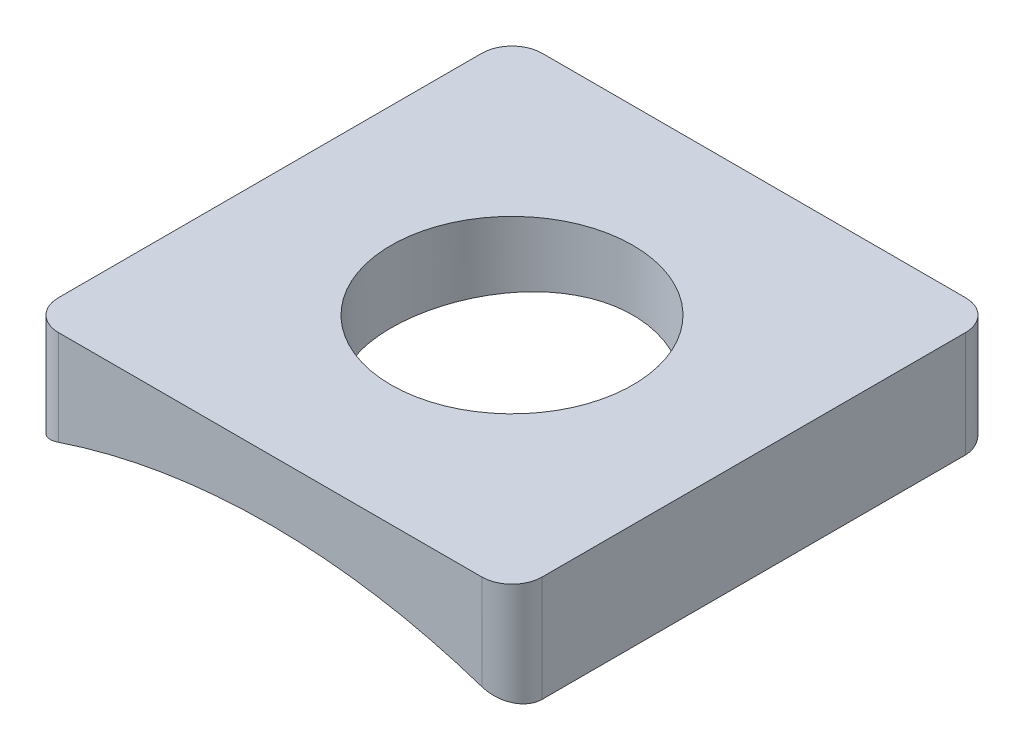
ISO-10303-21;
HEADER;
FILE_DESCRIPTION(('STEP AP214'),'2;1');
FILE_NAME('part.step','',(''),(''),'','','');
FILE_SCHEMA(('AUTOMOTIVE_DESIGN { 1 0 10303 214 1 1 1 1 }'));
ENDSEC;
DATA;
#1=APPLICATION_CONTEXT('core data for automotive mechanical design processes');
#2=APPLICATION_PROTOCOL_DEFINITION('international standard','automotive_design',2000,#1);
#3=PRODUCT_CONTEXT('',#1,'mechanical');
#4=PRODUCT('Part','Part','',(#3));
#5=PRODUCT_RELATED_PRODUCT_CATEGORY('part','',(#4));
#6=PRODUCT_DEFINITION_FORMATION('','',#4);
#7=PRODUCT_DEFINITION_CONTEXT('part definition',#1,'design');
#8=PRODUCT_DEFINITION('design','',#6,#7);
#9=PRODUCT_DEFINITION_SHAPE('','',#8);
#10=(LENGTH_UNIT() NAMED_UNIT(*) SI_UNIT(.MILLI.,.METRE.));
#11=(NAMED_UNIT(*) PLANE_ANGLE_UNIT() SI_UNIT($,.RADIAN.));
#12=(NAMED_UNIT(*) SI_UNIT($,.STERADIAN.) SOLID_ANGLE_UNIT());
#13=UNCERTAINTY_MEASURE_WITH_UNIT(LENGTH_MEASURE(1.E-05),#10,'distance_accuracy_value','');
#14=(GEOMETRIC_REPRESENTATION_CONTEXT(3) GLOBAL_UNCERTAINTY_ASSIGNED_CONTEXT((#13)) GLOBAL_UNIT_ASSIGNED_CONTEXT((#10,
#11,#12)) REPRESENTATION_CONTEXT('',''));
#15=CARTESIAN_POINT('',(0.,0.,0.));
#16=DIRECTION('',(0.,0.,1.));
#17=DIRECTION('',(1.,0.,0.));
#18=AXIS2_PLACEMENT_3D('',#15,#16,#17);
#19=CARTESIAN_POINT('',(0.,-11.1234753829798,8.));
#20=DIRECTION('',(0.,0.,-1.));
#21=DIRECTION('',(-1.,0.,0.));
#22=AXIS2_PLACEMENT_3D('',#19,#20,#21);
#23=CYLINDRICAL_SURFACE('',#22,11.);
#24=CARTESIAN_POINT('',(0.,-0.123475382979799,6.));
#25=CARTESIAN_POINT('',(-0.111357271644374,-0.123477375701219,5.99999568133932));
#26=CARTESIAN_POINT('',(-0.222771449918203,-0.125183855645452,5.99066824251735));
#27=CARTESIAN_POINT('',(-0.44246440684831,-0.13182690795984,5.95362653397508));
#28=CARTESIAN_POINT('',(-0.550740387266075,-0.136766275754395,5.92589635141863));
#29=CARTESIAN_POINT('',(-0.760947572513748,-0.149322150629141,5.85292287032901));
#30=CARTESIAN_POINT('',(-0.862884263930177,-0.156936303660599,5.80769496781024));
#31=CARTESIAN_POINT('',(-1.0577120033845,-0.174008667996809,5.70105266880821));
#32=CARTESIAN_POINT('',(-1.15060386767905,-0.183466712666582,5.6396397348118));
#33=CARTESIAN_POINT('',(-1.32576444051238,-0.203301047981474,5.50163409035729));
#34=CARTESIAN_POINT('',(-1.40791622603346,-0.213685657009012,5.42489415801924));
#35=CARTESIAN_POINT('',(-1.55825357341079,-0.234140430861728,5.25872964591017));
#36=CARTESIAN_POINT('',(-1.62643816794977,-0.244210573867217,5.16930418831085));
#37=CARTESIAN_POINT('',(-1.74738695016477,-0.262976980882142,4.97948727054022));
#38=CARTESIAN_POINT('',(-1.80003313265556,-0.27166251187882,4.87901946476962));
#39=CARTESIAN_POINT('',(-1.88765546949978,-0.286559550210778,4.67048134967603));
#40=CARTESIAN_POINT('',(-1.92263305283275,-0.29277125761236,4.56241165597496));
#41=CARTESIAN_POINT('',(-1.97355197711315,-0.301933847812737,4.3429853506434));
#42=CARTESIAN_POINT('',(-1.98969666425445,-0.304919536756361,4.23167740829037));
#43=CARTESIAN_POINT('',(-2.00312248736688,-0.307397068656701,4.00789559268543));
#44=CARTESIAN_POINT('',(-2.00040521296643,-0.306889206039284,3.89542181848397));
#45=CARTESIAN_POINT('',(-1.97634934427,-0.302468732488003,3.67396808586698));
#46=CARTESIAN_POINT('',(-1.95524117699072,-0.298598254837168,3.56496213210428));
#47=CARTESIAN_POINT('',(-1.89536523340026,-0.287954770240701,3.35206498163283));
#48=CARTESIAN_POINT('',(-1.85659674743188,-0.281181646656621,3.24817399064821));
#49=CARTESIAN_POINT('',(-1.76227297789296,-0.265451567452645,3.04777720922126));
#50=CARTESIAN_POINT('',(-1.7066239037154,-0.256482465836288,2.95131655733387));
#51=CARTESIAN_POINT('',(-1.58018503374043,-0.237379162862632,2.76901526305471));
#52=CARTESIAN_POINT('',(-1.50939379023584,-0.227244850145118,2.68317563735376));
#53=CARTESIAN_POINT('',(-1.35343399418352,-0.206768974894349,2.52322100355563));
#54=CARTESIAN_POINT('',(-1.2680681726569,-0.196426564815125,2.44929831156309));
#55=CARTESIAN_POINT('',(-1.08604454069331,-0.17683787860892,2.31679486651917));
#56=CARTESIAN_POINT('',(-0.989386629498158,-0.167591612264205,2.25821425037873));
#57=CARTESIAN_POINT('',(-0.787327598497297,-0.151220004726391,2.15803261021497));
#58=CARTESIAN_POINT('',(-0.681916780395493,-0.144097057387577,2.11645073130402));
#59=CARTESIAN_POINT('',(-0.465448414462667,-0.132793328270973,2.05163680750629));
#60=CARTESIAN_POINT('',(-0.354391431316065,-0.128612252888843,2.02840293142609));
#61=CARTESIAN_POINT('',(-0.1314386495785,-0.123703449193215,2.00121023808088));
#62=CARTESIAN_POINT('',(-0.0195760121089348,-0.122928489568368,1.99698777654592));
#63=CARTESIAN_POINT('',(0.203257238970967,-0.124789080504808,2.00723179818149));
#64=CARTESIAN_POINT('',(0.314227893453081,-0.127424473892694,2.02169742007174));
#65=CARTESIAN_POINT('',(0.531297097592757,-0.135780296655279,2.06868774956188));
#66=CARTESIAN_POINT('',(0.637425297458317,-0.141478067258185,2.10107986918283));
#67=CARTESIAN_POINT('',(0.84274471375661,-0.155322431757575,2.18286082852194));
#68=CARTESIAN_POINT('',(0.941935480960948,-0.163469184055446,2.2322507676977));
#69=CARTESIAN_POINT('',(1.13169524707493,-0.18142558713139,2.34721463780293));
#70=CARTESIAN_POINT('',(1.22216445208488,-0.191251566833794,2.41295068715592));
#71=CARTESIAN_POINT('',(1.39088213822347,-0.211432502268945,2.5585203766711));
#72=CARTESIAN_POINT('',(1.46912954974332,-0.221787504194749,2.63835524941194));
#73=CARTESIAN_POINT('',(1.6121773788768,-0.242014987403366,2.8110468814485));
#74=CARTESIAN_POINT('',(1.67679836741418,-0.251879861760943,2.90405330652586));
#75=CARTESIAN_POINT('',(1.78949986552013,-0.269860282169599,3.09975618140649));
#76=CARTESIAN_POINT('',(1.83758096630795,-0.277975890744411,3.20245228468438));
#77=CARTESIAN_POINT('',(1.91557945241746,-0.291479936825028,3.41415074969175));
#78=CARTESIAN_POINT('',(1.9455810786184,-0.296881002812321,3.52312123073806));
#79=CARTESIAN_POINT('',(1.98683040178554,-0.304374117525901,3.74466298863107));
#80=CARTESIAN_POINT('',(1.99808007453629,-0.306466514866214,3.85723388484892));
#81=CARTESIAN_POINT('',(2.00144313663184,-0.307088444153631,4.08098537546364));
#82=CARTESIAN_POINT('',(1.99383937001232,-0.30567063753865,4.19216167143854));
#83=CARTESIAN_POINT('',(1.96032846912814,-0.299548295509529,4.41162363801741));
#84=CARTESIAN_POINT('',(1.93442142905717,-0.294843777009718,4.51990932349428));
#85=CARTESIAN_POINT('',(1.86515567158476,-0.282699662170666,4.73037619739537));
#86=CARTESIAN_POINT('',(1.82182581019232,-0.275264589982328,4.83256716022343));
#87=CARTESIAN_POINT('',(1.71897473664823,-0.258493607831343,5.02827444716474));
#88=CARTESIAN_POINT('',(1.65945247569007,-0.249157574750404,5.12179020884558));
#89=CARTESIAN_POINT('',(1.52491543662799,-0.229472136465145,5.29891287459562));
#90=CARTESIAN_POINT('',(1.44969415553099,-0.219110304668741,5.38236156987076));
#91=CARTESIAN_POINT('',(1.28632651423364,-0.198635462293294,5.53554708101219));
#92=CARTESIAN_POINT('',(1.19817718680093,-0.188522509460649,5.60528074039225));
#93=CARTESIAN_POINT('',(1.0105711896463,-0.169585640007872,5.72960029712349));
#94=CARTESIAN_POINT('',(0.911025849790495,-0.160773251245486,5.78405418518013));
#95=CARTESIAN_POINT('',(0.704073905086344,-0.145542773046328,5.87537921607405));
#96=CARTESIAN_POINT('',(0.596674925486669,-0.139122397132461,5.91226715927832));
#97=CARTESIAN_POINT('',(0.407441749458404,-0.130734679214907,5.95977543030219));
#98=CARTESIAN_POINT('',(0.326725427276488,-0.128027580243962,5.97483433296035));
#99=CARTESIAN_POINT('',(0.164016342132201,-0.124397218649362,5.9949480937949));
#100=CARTESIAN_POINT('',(0.0820236084408317,-0.123473915179815,6.00000318104177));
#101=CARTESIAN_POINT('',(0.,-0.123475382979799,6.));
#102=B_SPLINE_CURVE_WITH_KNOTS('',3,(#24,#25,#26,#27,#28,#29,#30,#31,#32,#33,#34,#35,#36,#37,
#38,#39,#40,#41,#42,#43,#44,#45,#46,#47,#48,#49,#50,#51,#52,#53,#54,#55,#56,#57,#58,#59,#60,#61,
#62,#63,#64,#65,#66,#67,#68,#69,#70,#71,#72,#73,#74,#75,#76,#77,#78,#79,#80,#81,#82,#83,#84,#85,
#86,#87,#88,#89,#90,#91,#92,#93,#94,#95,#96,#97,#98,#99,#100,#101),.UNSPECIFIED.,.T.,.F.,(4,2,2,
2,2,2,2,2,2,2,2,2,2,2,2,2,2,2,2,2,2,2,2,2,2,2,2,2,2,2,2,2,2,2,2,2,2,2,4),(0.,0.333771891552332,
0.66783277207259,1.00160038286674,1.3353378446015,1.67245014596885,2.00958578663078,
2.3492195220365,2.6888257845573,3.02473021172645,3.36060633024202,3.69233367290895,
4.02407434678871,4.35769306461625,4.69134369321255,5.02993210441872,5.36852353704646,
5.70749527023812,6.04643316861453,6.38065600997364,6.71486344850797,7.0466314328543,
7.3784208807422,7.71364226795666,8.04889297616123,8.38831506130458,8.72772501252474,
9.06554101076157,9.40332141303602,9.73606509730371,10.0688070691931,10.4010002025896,
10.733214857769,11.0701111453004,11.4070848782946,11.7468860454293,12.0863615649817,
12.3322171022956,12.5780670098676),.UNSPECIFIED.);
#103=CARTESIAN_POINT('',(0.,-0.123475382979799,6.));
#104=VERTEX_POINT('',#103);
#105=EDGE_CURVE('E165',#104,#104,#102,.T.);
#106=ORIENTED_EDGE('',*,*,#105,.F.);
#107=EDGE_LOOP('',(#106));
#108=FACE_BOUND('',#107,.T.);
#109=DIRECTION('',(0.,0.,-1.));
#110=VECTOR('',#109,1.);
#111=CARTESIAN_POINT('',(4.,-0.8765246170202,8.));
#112=LINE('',#111,#110);
#113=CARTESIAN_POINT('',(4.,-0.8765246170202,7.5));
#114=VERTEX_POINT('',#113);
#115=CARTESIAN_POINT('',(4.,-0.8765246170202,0.5));
#116=VERTEX_POINT('',#115);
#117=EDGE_CURVE('E105',#114,#116,#112,.T.);
#118=ORIENTED_EDGE('',*,*,#117,.F.);
#119=CARTESIAN_POINT('',(4.,-0.8765246170202,7.5));
#120=CARTESIAN_POINT('',(4.00002926119375,-0.876539050228,7.52679793847715));
#121=CARTESIAN_POINT('',(3.99784765420979,-0.8756844452834,7.55357613379432));
#122=CARTESIAN_POINT('',(3.98929325406763,-0.872349763422063,7.6062765415116));
#123=CARTESIAN_POINT('',(3.98293217402858,-0.86987422928244,7.63220093411842));
#124=CARTESIAN_POINT('',(3.96624931919479,-0.863410028940407,7.68252830137912));
#125=CARTESIAN_POINT('',(3.95592861100959,-0.859421770225621,7.70693168369321));
#126=CARTESIAN_POINT('',(3.93170506817807,-0.850118376004065,7.75361847812932));
#127=CARTESIAN_POINT('',(3.91780076903868,-0.844802698053395,7.77590101842479));
#128=CARTESIAN_POINT('',(3.88638277589784,-0.832881688636479,7.81848057302149));
#129=CARTESIAN_POINT('',(3.86877143608486,-0.826241795037034,7.83869570110896));
#130=CARTESIAN_POINT('',(3.83075165954484,-0.81203739558425,7.8759142896838));
#131=CARTESIAN_POINT('',(3.81034238422242,-0.804472612597484,7.89291678363523));
#132=CARTESIAN_POINT('',(3.76589736441935,-0.788166417595739,7.92436565466008));
#133=CARTESIAN_POINT('',(3.74171322897084,-0.779380708625196,7.93857929458434));
#134=CARTESIAN_POINT('',(3.69145836282711,-0.7613400748389,7.96273217881594));
#135=CARTESIAN_POINT('',(3.6653874480745,-0.752085104272602,7.97267100545218));
#136=CARTESIAN_POINT('',(3.61617768744602,-0.734836056855122,7.98688078866286));
#137=CARTESIAN_POINT('',(3.59321154791465,-0.726869149261555,7.99179189774458));
#138=CARTESIAN_POINT('',(3.54684144313027,-0.710957577948796,7.9983521107214));
#139=CARTESIAN_POINT('',(3.52343802435453,-0.703012899090044,8.00000504283632));
#140=CARTESIAN_POINT('',(3.5,-0.695148575672694,8.));
#141=B_SPLINE_CURVE_WITH_KNOTS('',3,(#119,#120,#121,#122,#123,#124,#125,#126,#127,#128,#129,
#130,#131,#132,#133,#134,#135,#136,#137,#138,#139,#140),.UNSPECIFIED.,.F.,.F.,(4,2,2,2,2,2,2,2,
2,2,4),(0.,0.0802609593214698,0.160297938479232,0.240313373105153,0.320361559340183,
0.402865541771658,0.485394306525627,0.573196249706827,0.661006769638897,0.735192632455148,
0.809291277946741),.UNSPECIFIED.);
#142=CARTESIAN_POINT('',(3.5,-0.695148575672693,8.));
#143=VERTEX_POINT('',#142);
#144=EDGE_CURVE('E101',#114,#143,#141,.T.);
#145=ORIENTED_EDGE('',*,*,#144,.T.);
#146=CARTESIAN_POINT('',(0.,-11.1234753829798,8.));
#147=DIRECTION('',(0.,0.,1.));
#148=DIRECTION('',(1.,0.,0.));
#149=AXIS2_PLACEMENT_3D('',#146,#147,#148);
#150=CIRCLE('',#149,11.);
#151=CARTESIAN_POINT('',(-3.5,-0.695148575672693,8.));
#152=VERTEX_POINT('',#151);
#153=EDGE_CURVE('E103',#143,#152,#150,.T.);
#154=ORIENTED_EDGE('',*,*,#153,.T.);
#155=CARTESIAN_POINT('',(-3.5,-0.695148575672693,8.));
#156=CARTESIAN_POINT('',(-3.52957804144937,-0.705070311924606,8.00001610070711));
#157=CARTESIAN_POINT('',(-3.55910613137349,-0.715125881497296,7.99737644481001));
#158=CARTESIAN_POINT('',(-3.61727098128616,-0.735199881707838,7.98694622062459));
#159=CARTESIAN_POINT('',(-3.64590722767449,-0.74521828812216,7.97915273972513));
#160=CARTESIAN_POINT('',(-3.70148027350935,-0.764907819290062,7.95856892791797));
#161=CARTESIAN_POINT('',(-3.72841592223357,-0.774578707025822,7.9457752548056));
#162=CARTESIAN_POINT('',(-3.77975656171976,-0.793219611247229,7.91548006579633));
#163=CARTESIAN_POINT('',(-3.80416266704477,-0.802189935980605,7.89798063566461));
#164=CARTESIAN_POINT('',(-3.84919692177933,-0.81890115886939,7.85906731997363));
#165=CARTESIAN_POINT('',(-3.86989113379555,-0.826663140050115,7.83773916180443));
#166=CARTESIAN_POINT('',(-3.9073499336634,-0.840819183342786,7.79146376505385));
#167=CARTESIAN_POINT('',(-3.9241147351632,-0.847213319824923,7.76651672335624));
#168=CARTESIAN_POINT('',(-3.95217237707878,-0.85797262381799,7.71527564444825));
#169=CARTESIAN_POINT('',(-3.96372772075448,-0.862434518620778,7.6891454984082));
#170=CARTESIAN_POINT('',(-3.9822457471531,-0.869606896525241,7.63509855645871));
#171=CARTESIAN_POINT('',(-3.98921592445591,-0.8723202375373,7.60718475834299));
#172=CARTESIAN_POINT('',(-3.99582461813297,-0.874895494154426,7.56582613226832));
#173=CARTESIAN_POINT('',(-3.99738972254134,-0.875505967159918,7.55270813652345));
#174=CARTESIAN_POINT('',(-3.99947664915392,-0.876320299428102,7.5263958336026));
#175=CARTESIAN_POINT('',(-3.9999999619229,-0.876524739629571,7.51320166258211));
#176=CARTESIAN_POINT('',(-4.00000000000001,-0.876524617020188,7.5));
#177=B_SPLINE_CURVE_WITH_KNOTS('',3,(#155,#156,#157,#158,#159,#160,#161,#162,#163,#164,#165,
#166,#167,#168,#169,#170,#171,#172,#173,#174,#175,#176),.UNSPECIFIED.,.F.,.F.,(4,2,2,2,2,2,2,2,
2,2,4),(0.,0.0934766339438659,0.187006140079088,0.280598269974272,0.374148984565127,
0.465819797943053,0.55748562587964,0.64379508823545,0.7299631225445,0.7695981509023,
0.809176429755845),.UNSPECIFIED.);
#178=CARTESIAN_POINT('',(-4.,-0.8765246170202,7.5));
#179=VERTEX_POINT('',#178);
#180=EDGE_CURVE('E57',#152,#179,#177,.T.);
#181=ORIENTED_EDGE('',*,*,#180,.T.);
#182=DIRECTION('',(0.,0.,-1.));
#183=VECTOR('',#182,1.);
#184=CARTESIAN_POINT('',(-4.,-0.8765246170202,8.));
#185=LINE('',#184,#183);
#186=CARTESIAN_POINT('',(-4.,-0.8765246170202,0.5));
#187=VERTEX_POINT('',#186);
#188=EDGE_CURVE('E201',#179,#187,#185,.T.);
#189=ORIENTED_EDGE('',*,*,#188,.T.);
#190=CARTESIAN_POINT('',(-4.,-0.8765246170202,0.5));
#191=CARTESIAN_POINT('',(-4.00002926119375,-0.876539050228,0.473202061522851));
#192=CARTESIAN_POINT('',(-3.99784765420979,-0.875684445283401,0.446423866205677));
#193=CARTESIAN_POINT('',(-3.98929325406763,-0.872349763422063,0.393723458488401));
#194=CARTESIAN_POINT('',(-3.98293217402857,-0.86987422928244,0.367799065881581));
#195=CARTESIAN_POINT('',(-3.96624931919479,-0.863410028940407,0.317471698620879));
#196=CARTESIAN_POINT('',(-3.95592861100959,-0.859421770225621,0.29306831630679));
#197=CARTESIAN_POINT('',(-3.93170506817807,-0.850118376004064,0.246381521870675));
#198=CARTESIAN_POINT('',(-3.91780076903868,-0.844802698053394,0.224098981575208));
#199=CARTESIAN_POINT('',(-3.88638277589784,-0.832881688636479,0.18151942697851));
#200=CARTESIAN_POINT('',(-3.86877143608486,-0.826241795037036,0.161304298891042));
#201=CARTESIAN_POINT('',(-3.83075165954484,-0.812037395584252,0.124085710316201));
#202=CARTESIAN_POINT('',(-3.81034238422242,-0.804472612597485,0.107083216364772));
#203=CARTESIAN_POINT('',(-3.76589736441935,-0.78816641759574,0.0756343453399179));
#204=CARTESIAN_POINT('',(-3.74171322897084,-0.779380708625198,0.0614207054156574));
#205=CARTESIAN_POINT('',(-3.69145836282711,-0.761340074838901,0.0372678211840589));
#206=CARTESIAN_POINT('',(-3.6653874480745,-0.752085104272601,0.027328994547825));
#207=CARTESIAN_POINT('',(-3.61617768744602,-0.73483605685512,0.0131192113371405));
#208=CARTESIAN_POINT('',(-3.59321154791465,-0.726869149261553,0.00820810225541985));
#209=CARTESIAN_POINT('',(-3.54684144313027,-0.710957577948795,0.00164788927859932));
#210=CARTESIAN_POINT('',(-3.52343802435454,-0.703012899090043,-5.04283632376432E-06));
#211=CARTESIAN_POINT('',(-3.5,-0.695148575672694,0.));
#212=B_SPLINE_CURVE_WITH_KNOTS('',3,(#190,#191,#192,#193,#194,#195,#196,#197,#198,#199,#200,
#201,#202,#203,#204,#205,#206,#207,#208,#209,#210,#211),.UNSPECIFIED.,.F.,.F.,(4,2,2,2,2,2,2,2,
2,2,4),(0.,0.0802609593214706,0.160297938479232,0.240313373105154,0.320361559340183,
0.402865541771656,0.485394306525625,0.573196249706826,0.661006769638897,0.735192632455147,
0.809291277946741),.UNSPECIFIED.);
#213=CARTESIAN_POINT('',(-3.5,-0.695148575672693,0.));
#214=VERTEX_POINT('',#213);
#215=EDGE_CURVE('E147',#187,#214,#212,.T.);
#216=ORIENTED_EDGE('',*,*,#215,.T.);
#217=CARTESIAN_POINT('',(0.,-11.1234753829798,0.));
#218=DIRECTION('',(0.,0.,1.));
#219=DIRECTION('',(1.,0.,0.));
#220=AXIS2_PLACEMENT_3D('',#217,#218,#219);
#221=CIRCLE('',#220,11.);
#222=CARTESIAN_POINT('',(3.5,-0.695148575672693,0.));
#223=VERTEX_POINT('',#222);
#224=EDGE_CURVE('E199',#223,#214,#221,.T.);
#225=ORIENTED_EDGE('',*,*,#224,.F.);
#226=CARTESIAN_POINT('',(3.5,-0.695148575672693,0.));
#227=CARTESIAN_POINT('',(3.52957804144937,-0.705070311924606,-1.61007071083574E-05));
#228=CARTESIAN_POINT('',(3.55910613137349,-0.715125881497297,0.00262355518999198));
#229=CARTESIAN_POINT('',(3.61727098128616,-0.735199881707838,0.0130537793754126));
#230=CARTESIAN_POINT('',(3.64590722767449,-0.74521828812216,0.0208472602748722));
#231=CARTESIAN_POINT('',(3.70148027350935,-0.764907819290063,0.0414310720820341));
#232=CARTESIAN_POINT('',(3.72841592223357,-0.774578707025823,0.054224745194396));
#233=CARTESIAN_POINT('',(3.77975656171976,-0.793219611247229,0.0845199342036697));
#234=CARTESIAN_POINT('',(3.80416266704477,-0.802189935980603,0.102019364335393));
#235=CARTESIAN_POINT('',(3.84919692177933,-0.818901158869389,0.140932680026368));
#236=CARTESIAN_POINT('',(3.86989113379555,-0.826663140050115,0.162260838195568));
#237=CARTESIAN_POINT('',(3.9073499336634,-0.840819183342787,0.208536234946152));
#238=CARTESIAN_POINT('',(3.9241147351632,-0.847213319824923,0.23348327664376));
#239=CARTESIAN_POINT('',(3.95217237707878,-0.857972623817989,0.28472435555175));
#240=CARTESIAN_POINT('',(3.96372772075448,-0.862434518620778,0.310854501591802));
#241=CARTESIAN_POINT('',(3.9822457471531,-0.869606896525242,0.36490144354129));
#242=CARTESIAN_POINT('',(3.98921592445591,-0.8723202375373,0.392815241657007));
#243=CARTESIAN_POINT('',(3.99582461813297,-0.874895494154426,0.43417386773168));
#244=CARTESIAN_POINT('',(3.99738972254134,-0.875505967159918,0.447291863476553));
#245=CARTESIAN_POINT('',(3.99947664915392,-0.876320299428102,0.473604166397395));
#246=CARTESIAN_POINT('',(3.9999999619229,-0.876524739629571,0.486798337417891));
#247=CARTESIAN_POINT('',(4.00000000000001,-0.876524617020188,0.5));
#248=B_SPLINE_CURVE_WITH_KNOTS('',3,(#226,#227,#228,#229,#230,#231,#232,#233,#234,#235,#236,
#237,#238,#239,#240,#241,#242,#243,#244,#245,#246,#247),.UNSPECIFIED.,.F.,.F.,(4,2,2,2,2,2,2,2,
2,2,4),(0.,0.0934766339438662,0.187006140079089,0.280598269974272,0.374148984565129,
0.465819797943053,0.55748562587964,0.64379508823545,0.7299631225445,0.7695981509023,
0.809176429755845),.UNSPECIFIED.);
#249=EDGE_CURVE('E110',#223,#116,#248,.T.);
#250=ORIENTED_EDGE('',*,*,#249,.T.);
#251=EDGE_LOOP('',(#118,#145,#154,#181,#189,#216,#225,#250));
#252=FACE_BOUND('',#251,.T.);
#253=ADVANCED_FACE('F36',(#108,#252),#23,.F.);
#254=CARTESIAN_POINT('',(4.,0.,8.));
#255=DIRECTION('',(-1.,0.,0.));
#256=DIRECTION('',(0.,0.,1.));
#257=AXIS2_PLACEMENT_3D('',#254,#255,#256);
#258=PLANE('',#257);
#259=DIRECTION('',(0.,0.,-1.));
#260=VECTOR('',#259,1.);
#261=CARTESIAN_POINT('',(4.,0.876524617020201,8.));
#262=LINE('',#261,#260);
#263=CARTESIAN_POINT('',(4.,0.876524617020201,7.5));
#264=VERTEX_POINT('',#263);
#265=CARTESIAN_POINT('',(4.,0.876524617020201,0.5));
#266=VERTEX_POINT('',#265);
#267=EDGE_CURVE('E217',#264,#266,#262,.T.);
#268=ORIENTED_EDGE('',*,*,#267,.F.);
#269=DIRECTION('',(0.,1.,0.));
#270=VECTOR('',#269,1.);
#271=CARTESIAN_POINT('',(4.,-0.8765246170202,7.5));
#272=LINE('',#271,#270);
#273=EDGE_CURVE('E139',#264,#114,#272,.F.);
#274=ORIENTED_EDGE('',*,*,#273,.T.);
#275=ORIENTED_EDGE('',*,*,#117,.T.);
#276=DIRECTION('',(0.,1.,0.));
#277=VECTOR('',#276,1.);
#278=CARTESIAN_POINT('',(4.,0.,0.5));
#279=LINE('',#278,#277);
#280=EDGE_CURVE('E136',#116,#266,#279,.T.);
#281=ORIENTED_EDGE('',*,*,#280,.T.);
#282=EDGE_LOOP('',(#268,#274,#275,#281));
#283=FACE_BOUND('',#282,.T.);
#284=ADVANCED_FACE('F157',(#283),#258,.F.);
#285=CARTESIAN_POINT('',(0.,0.876524617020201,8.));
#286=DIRECTION('',(0.,-1.,0.));
#287=DIRECTION('',(0.,0.,-1.));
#288=AXIS2_PLACEMENT_3D('',#285,#286,#287);
#289=PLANE('',#288);
#290=CARTESIAN_POINT('',(0.,0.876524617020201,4.));
#291=DIRECTION('',(0.,1.,0.));
#292=DIRECTION('',(0.,0.,1.));
#293=AXIS2_PLACEMENT_3D('',#290,#291,#292);
#294=CIRCLE('',#293,2.);
#295=CARTESIAN_POINT('',(0.,0.876524617020201,6.));
#296=VERTEX_POINT('',#295);
#297=EDGE_CURVE('E211',#296,#296,#294,.T.);
#298=ORIENTED_EDGE('',*,*,#297,.F.);
#299=EDGE_LOOP('',(#298));
#300=FACE_BOUND('',#299,.T.);
#301=DIRECTION('',(-1.,0.,0.));
#302=VECTOR('',#301,1.);
#303=CARTESIAN_POINT('',(0.,0.876524617020201,8.));
#304=LINE('',#303,#302);
#305=CARTESIAN_POINT('',(3.5,0.876524617020201,8.));
#306=VERTEX_POINT('',#305);
#307=CARTESIAN_POINT('',(-3.5,0.876524617020201,8.));
#308=VERTEX_POINT('',#307);
#309=EDGE_CURVE('E120',#306,#308,#304,.T.);
#310=ORIENTED_EDGE('',*,*,#309,.F.);
#311=CARTESIAN_POINT('',(3.5,0.876524617020201,7.5));
#312=DIRECTION('',(0.,-1.,0.));
#313=DIRECTION('',(0.,0.,-1.));
#314=AXIS2_PLACEMENT_3D('',#311,#312,#313);
#315=CIRCLE('',#314,0.5);
#316=EDGE_CURVE('E124',#306,#264,#315,.F.);
#317=ORIENTED_EDGE('',*,*,#316,.T.);
#318=ORIENTED_EDGE('',*,*,#267,.T.);
#319=CARTESIAN_POINT('',(3.5,0.876524617020201,0.5));
#320=DIRECTION('',(0.,-1.,0.));
#321=DIRECTION('',(0.,0.,-1.));
#322=AXIS2_PLACEMENT_3D('',#319,#320,#321);
#323=CIRCLE('',#322,0.5);
#324=CARTESIAN_POINT('',(3.5,0.876524617020201,0.));
#325=VERTEX_POINT('',#324);
#326=EDGE_CURVE('E133',#266,#325,#323,.F.);
#327=ORIENTED_EDGE('',*,*,#326,.T.);
#328=DIRECTION('',(-1.,0.,0.));
#329=VECTOR('',#328,1.);
#330=CARTESIAN_POINT('',(0.,0.876524617020201,0.));
#331=LINE('',#330,#329);
#332=CARTESIAN_POINT('',(-3.5,0.876524617020201,0.));
#333=VERTEX_POINT('',#332);
#334=EDGE_CURVE('E121',#325,#333,#331,.T.);
#335=ORIENTED_EDGE('',*,*,#334,.T.);
#336=CARTESIAN_POINT('',(-3.5,0.876524617020201,0.5));
#337=DIRECTION('',(0.,-1.,0.));
#338=DIRECTION('',(0.,0.,-1.));
#339=AXIS2_PLACEMENT_3D('',#336,#337,#338);
#340=CIRCLE('',#339,0.5);
#341=CARTESIAN_POINT('',(-4.,0.876524617020201,0.5));
#342=VERTEX_POINT('',#341);
#343=EDGE_CURVE('E127',#333,#342,#340,.F.);
#344=ORIENTED_EDGE('',*,*,#343,.T.);
#345=DIRECTION('',(0.,0.,-1.));
#346=VECTOR('',#345,1.);
#347=CARTESIAN_POINT('',(-4.,0.876524617020201,8.));
#348=LINE('',#347,#346);
#349=CARTESIAN_POINT('',(-4.,0.876524617020201,7.5));
#350=VERTEX_POINT('',#349);
#351=EDGE_CURVE('E215',#350,#342,#348,.T.);
#352=ORIENTED_EDGE('',*,*,#351,.F.);
#353=CARTESIAN_POINT('',(-3.5,0.876524617020201,7.5));
#354=DIRECTION('',(0.,-1.,0.));
#355=DIRECTION('',(0.,0.,-1.));
#356=AXIS2_PLACEMENT_3D('',#353,#354,#355);
#357=CIRCLE('',#356,0.5);
#358=EDGE_CURVE('E125',#350,#308,#357,.F.);
#359=ORIENTED_EDGE('',*,*,#358,.T.);
#360=EDGE_LOOP('',(#310,#317,#318,#327,#335,#344,#352,#359));
#361=FACE_BOUND('',#360,.T.);
#362=ADVANCED_FACE('F223',(#300,#361),#289,.F.);
#363=CARTESIAN_POINT('',(-4.,0.,8.));
#364=DIRECTION('',(-1.,0.,0.));
#365=DIRECTION('',(0.,0.,1.));
#366=AXIS2_PLACEMENT_3D('',#363,#364,#365);
#367=PLANE('',#366);
#368=ORIENTED_EDGE('',*,*,#351,.T.);
#369=DIRECTION('',(0.,1.,0.));
#370=VECTOR('',#369,1.);
#371=CARTESIAN_POINT('',(-4.,-0.8765246170202,0.5));
#372=LINE('',#371,#370);
#373=EDGE_CURVE('E11',#342,#187,#372,.F.);
#374=ORIENTED_EDGE('',*,*,#373,.T.);
#375=ORIENTED_EDGE('',*,*,#188,.F.);
#376=DIRECTION('',(0.,1.,0.));
#377=VECTOR('',#376,1.);
#378=CARTESIAN_POINT('',(-4.,0.,7.5));
#379=LINE('',#378,#377);
#380=EDGE_CURVE('E45',#179,#350,#379,.T.);
#381=ORIENTED_EDGE('',*,*,#380,.T.);
#382=EDGE_LOOP('',(#368,#374,#375,#381));
#383=FACE_BOUND('',#382,.T.);
#384=ADVANCED_FACE('F228',(#383),#367,.T.);
#385=CARTESIAN_POINT('',(0.,0.,8.));
#386=DIRECTION('',(0.,0.,1.));
#387=DIRECTION('',(1.,0.,0.));
#388=AXIS2_PLACEMENT_3D('',#385,#386,#387);
#389=PLANE('',#388);
#390=ORIENTED_EDGE('',*,*,#153,.F.);
#391=DIRECTION('',(0.,1.,0.));
#392=VECTOR('',#391,1.);
#393=CARTESIAN_POINT('',(3.5,0.876524617020201,8.));
#394=LINE('',#393,#392);
#395=EDGE_CURVE('E116',#143,#306,#394,.T.);
#396=ORIENTED_EDGE('',*,*,#395,.T.);
#397=ORIENTED_EDGE('',*,*,#309,.T.);
#398=DIRECTION('',(0.,1.,0.));
#399=VECTOR('',#398,1.);
#400=CARTESIAN_POINT('',(-3.5,0.,8.));
#401=LINE('',#400,#399);
#402=EDGE_CURVE('E119',#308,#152,#401,.F.);
#403=ORIENTED_EDGE('',*,*,#402,.T.);
#404=EDGE_LOOP('',(#390,#396,#397,#403));
#405=FACE_BOUND('',#404,.T.);
#406=ADVANCED_FACE('F114',(#405),#389,.T.);
#407=CARTESIAN_POINT('',(0.,0.,0.));
#408=DIRECTION('',(0.,0.,1.));
#409=DIRECTION('',(1.,0.,0.));
#410=AXIS2_PLACEMENT_3D('',#407,#408,#409);
#411=PLANE('',#410);
#412=ORIENTED_EDGE('',*,*,#334,.F.);
#413=DIRECTION('',(0.,1.,0.));
#414=VECTOR('',#413,1.);
#415=CARTESIAN_POINT('',(3.5,0.,0.));
#416=LINE('',#415,#414);
#417=EDGE_CURVE('E207',#325,#223,#416,.F.);
#418=ORIENTED_EDGE('',*,*,#417,.T.);
#419=ORIENTED_EDGE('',*,*,#224,.T.);
#420=DIRECTION('',(0.,1.,0.));
#421=VECTOR('',#420,1.);
#422=CARTESIAN_POINT('',(-3.5,0.876524617020201,0.));
#423=LINE('',#422,#421);
#424=EDGE_CURVE('E109',#214,#333,#423,.T.);
#425=ORIENTED_EDGE('',*,*,#424,.T.);
#426=EDGE_LOOP('',(#412,#418,#419,#425));
#427=FACE_BOUND('',#426,.T.);
#428=ADVANCED_FACE('F204',(#427),#411,.F.);
#429=CARTESIAN_POINT('',(0.,-7.1234753829798,4.));
#430=DIRECTION('',(0.,1.,0.));
#431=DIRECTION('',(0.,0.,1.));
#432=AXIS2_PLACEMENT_3D('',#429,#430,#431);
#433=CYLINDRICAL_SURFACE('',#432,2.);
#434=ORIENTED_EDGE('',*,*,#105,.T.);
#435=EDGE_LOOP('',(#434));
#436=FACE_BOUND('',#435,.T.);
#437=ORIENTED_EDGE('',*,*,#297,.T.);
#438=EDGE_LOOP('',(#437));
#439=FACE_BOUND('',#438,.T.);
#440=ADVANCED_FACE('F239',(#436,#439),#433,.F.);
#441=CARTESIAN_POINT('',(3.5,0.,7.5));
#442=DIRECTION('',(0.,-1.,0.));
#443=DIRECTION('',(0.,0.,-1.));
#444=AXIS2_PLACEMENT_3D('',#441,#442,#443);
#445=CYLINDRICAL_SURFACE('',#444,0.5);
#446=ORIENTED_EDGE('',*,*,#144,.F.);
#447=ORIENTED_EDGE('',*,*,#273,.F.);
#448=ORIENTED_EDGE('',*,*,#316,.F.);
#449=ORIENTED_EDGE('',*,*,#395,.F.);
#450=EDGE_LOOP('',(#446,#447,#448,#449));
#451=FACE_BOUND('',#450,.T.);
#452=ADVANCED_FACE('F123',(#451),#445,.T.);
#453=CARTESIAN_POINT('',(3.5,0.,0.5));
#454=DIRECTION('',(0.,1.,0.));
#455=DIRECTION('',(0.,0.,1.));
#456=AXIS2_PLACEMENT_3D('',#453,#454,#455);
#457=CYLINDRICAL_SURFACE('',#456,0.5);
#458=ORIENTED_EDGE('',*,*,#249,.F.);
#459=ORIENTED_EDGE('',*,*,#417,.F.);
#460=ORIENTED_EDGE('',*,*,#326,.F.);
#461=ORIENTED_EDGE('',*,*,#280,.F.);
#462=EDGE_LOOP('',(#458,#459,#460,#461));
#463=FACE_BOUND('',#462,.T.);
#464=ADVANCED_FACE('F182',(#463),#457,.T.);
#465=CARTESIAN_POINT('',(-3.5,0.,0.5));
#466=DIRECTION('',(0.,-1.,0.));
#467=DIRECTION('',(0.,0.,-1.));
#468=AXIS2_PLACEMENT_3D('',#465,#466,#467);
#469=CYLINDRICAL_SURFACE('',#468,0.5);
#470=ORIENTED_EDGE('',*,*,#215,.F.);
#471=ORIENTED_EDGE('',*,*,#373,.F.);
#472=ORIENTED_EDGE('',*,*,#343,.F.);
#473=ORIENTED_EDGE('',*,*,#424,.F.);
#474=EDGE_LOOP('',(#470,#471,#472,#473));
#475=FACE_BOUND('',#474,.T.);
#476=ADVANCED_FACE('F185',(#475),#469,.T.);
#477=CARTESIAN_POINT('',(-3.5,0.,7.5));
#478=DIRECTION('',(0.,1.,0.));
#479=DIRECTION('',(0.,0.,1.));
#480=AXIS2_PLACEMENT_3D('',#477,#478,#479);
#481=CYLINDRICAL_SURFACE('',#480,0.5);
#482=ORIENTED_EDGE('',*,*,#180,.F.);
#483=ORIENTED_EDGE('',*,*,#402,.F.);
#484=ORIENTED_EDGE('',*,*,#358,.F.);
#485=ORIENTED_EDGE('',*,*,#380,.F.);
#486=EDGE_LOOP('',(#482,#483,#484,#485));
#487=FACE_BOUND('',#486,.T.);
#488=ADVANCED_FACE('F38',(#487),#481,.T.);
#489=CLOSED_SHELL('',(#253,#284,#362,#384,#406,#428,#440,#452,#464,#476,#488));
#490=MANIFOLD_SOLID_BREP('B2',#489);
#491=ADVANCED_BREP_SHAPE_REPRESENTATION('',(#18,#490),#14);
#492=SHAPE_DEFINITION_REPRESENTATION(#9,#491);
ENDSEC;
END-ISO-10303-21;
